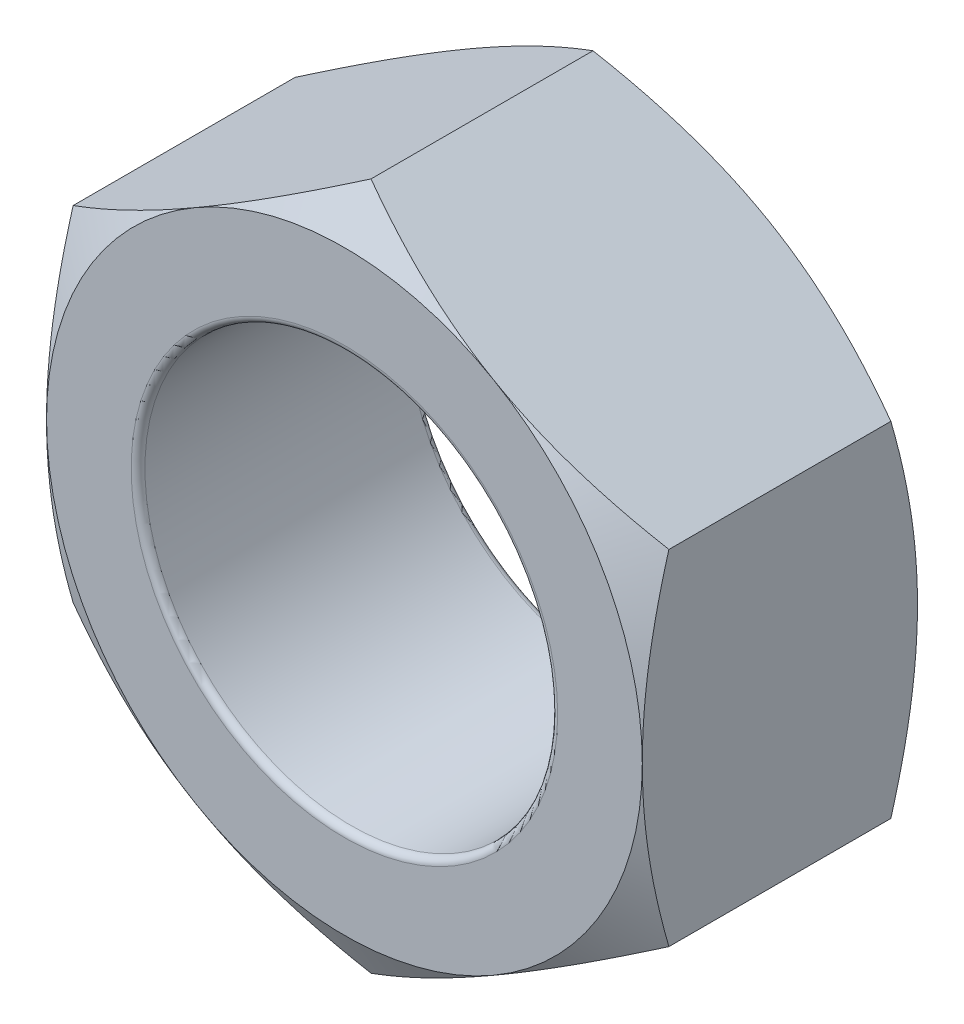
ISO-10303-21;
HEADER;
FILE_DESCRIPTION(('STEP AP214'),'2;1');
FILE_NAME('part.step','',(''),(''),'','','');
FILE_SCHEMA(('AUTOMOTIVE_DESIGN { 1 0 10303 214 1 1 1 1 }'));
ENDSEC;
DATA;
#1=APPLICATION_CONTEXT('core data for automotive mechanical design processes');
#2=APPLICATION_PROTOCOL_DEFINITION('international standard','automotive_design',2000,#1);
#3=PRODUCT_CONTEXT('',#1,'mechanical');
#4=PRODUCT('Part','Part','',(#3));
#5=PRODUCT_RELATED_PRODUCT_CATEGORY('part','',(#4));
#6=PRODUCT_DEFINITION_FORMATION('','',#4);
#7=PRODUCT_DEFINITION_CONTEXT('part definition',#1,'design');
#8=PRODUCT_DEFINITION('design','',#6,#7);
#9=PRODUCT_DEFINITION_SHAPE('','',#8);
#10=(LENGTH_UNIT() NAMED_UNIT(*) SI_UNIT(.MILLI.,.METRE.));
#11=(NAMED_UNIT(*) PLANE_ANGLE_UNIT() SI_UNIT($,.RADIAN.));
#12=(NAMED_UNIT(*) SI_UNIT($,.STERADIAN.) SOLID_ANGLE_UNIT());
#13=UNCERTAINTY_MEASURE_WITH_UNIT(LENGTH_MEASURE(1.E-05),#10,'distance_accuracy_value','');
#14=(GEOMETRIC_REPRESENTATION_CONTEXT(3) GLOBAL_UNCERTAINTY_ASSIGNED_CONTEXT((#13)) GLOBAL_UNIT_ASSIGNED_CONTEXT((#10,
#11,#12)) REPRESENTATION_CONTEXT('',''));
#15=CARTESIAN_POINT('',(0.,0.,0.));
#16=DIRECTION('',(0.,0.,1.));
#17=DIRECTION('',(1.,0.,0.));
#18=AXIS2_PLACEMENT_3D('',#15,#16,#17);
#19=CARTESIAN_POINT('',(2.1650635094611,1.25,2.));
#20=DIRECTION('',(-0.5,-0.866025403784439,0.));
#21=DIRECTION('',(0.866025403784439,-0.5,0.));
#22=AXIS2_PLACEMENT_3D('',#19,#20,#21);
#23=PLANE('',#22);
#24=CARTESIAN_POINT('',(-0.000199999999999995,2.50011547005384,0.193442344259319));
#25=CARTESIAN_POINT('',(0.0949448044588714,2.44518359158751,0.1617138656523));
#26=CARTESIAN_POINT('',(0.19091089006067,2.38977754623224,0.132857638622771));
#27=CARTESIAN_POINT('',(0.384504924957482,2.27800597807106,0.082488041578461));
#28=CARTESIAN_POINT('',(0.482136314962227,2.22163846877046,0.0609924917932506));
#29=CARTESIAN_POINT('',(0.676189096729384,2.1096020429802,0.0275304926651336));
#30=CARTESIAN_POINT('',(0.772580625603762,2.05395036783698,0.0153413537334432));
#31=CARTESIAN_POINT('',(0.965817397426061,1.94238506560804,0.000788247088698151));
#32=CARTESIAN_POINT('',(1.06266193768815,1.88647184421818,-0.00158776993784357));
#33=CARTESIAN_POINT('',(1.24363193289309,1.78198876877136,0.00334676203409698));
#34=CARTESIAN_POINT('',(1.32778443459629,1.73340329926004,0.00944571351687403));
#35=CARTESIAN_POINT('',(1.49554116707323,1.63654890460611,0.028778422494548));
#36=CARTESIAN_POINT('',(1.57914481731117,1.588280314636,0.0420187884503186));
#37=CARTESIAN_POINT('',(1.74724762493064,1.49122611340536,0.0751197068916935));
#38=CARTESIAN_POINT('',(1.83172549874872,1.44245279021593,0.095120617710467));
#39=CARTESIAN_POINT('',(1.99942104705477,1.34563372025953,0.140515214481965));
#40=CARTESIAN_POINT('',(2.08264087112059,1.29758673243321,0.165898229502511));
#41=CARTESIAN_POINT('',(2.1652635094611,1.24988452994616,0.193442344259319));
#42=B_SPLINE_CURVE_WITH_KNOTS('',3,(#24,#25,#26,#27,#28,#29,#30,#31,#32,#33,#34,#35,#36,#37,#38,
#39,#40,#41),.UNSPECIFIED.,.F.,.F.,(4,2,2,2,2,2,2,2,4),(0.,0.343195712322224,0.687216523785884,
1.02272234384044,1.3578160810825,1.64962474967976,1.94170391412719,2.24026314832885,
2.5382358827389),.UNSPECIFIED.);
#43=CARTESIAN_POINT('',(0.,2.5,0.193375672974063));
#44=VERTEX_POINT('',#43);
#45=CARTESIAN_POINT('',(1.08253175473055,1.875,0.));
#46=VERTEX_POINT('',#45);
#47=EDGE_CURVE('E60',#44,#46,#42,.T.);
#48=ORIENTED_EDGE('',*,*,#47,.F.);
#49=DIRECTION('',(0.,0.,-1.));
#50=VECTOR('',#49,1.);
#51=CARTESIAN_POINT('',(0.,2.5,2.));
#52=LINE('',#51,#50);
#53=CARTESIAN_POINT('',(0.,2.5,1.80662432702594));
#54=VERTEX_POINT('',#53);
#55=EDGE_CURVE('E178',#54,#44,#52,.T.);
#56=ORIENTED_EDGE('',*,*,#55,.F.);
#57=CARTESIAN_POINT('',(2.1652635094611,1.24988452994616,1.80655765574068));
#58=CARTESIAN_POINT('',(2.07011870500222,1.30481640841249,1.8382861343477));
#59=CARTESIAN_POINT('',(1.97415261940043,1.36022245376776,1.86714236137723));
#60=CARTESIAN_POINT('',(1.78055858450361,1.47199402192894,1.91751195842154));
#61=CARTESIAN_POINT('',(1.68292719449887,1.52836153122954,1.93900750820675));
#62=CARTESIAN_POINT('',(1.48887441273171,1.6403979570198,1.97246950733487));
#63=CARTESIAN_POINT('',(1.39248288385733,1.69604963216302,1.98465864626656));
#64=CARTESIAN_POINT('',(1.19924611203503,1.80761493439196,1.9992117529113));
#65=CARTESIAN_POINT('',(1.10240157177295,1.86352815578182,2.00158776993784));
#66=CARTESIAN_POINT('',(0.921431576568005,1.96801123122864,1.9966532379659));
#67=CARTESIAN_POINT('',(0.837279074864811,2.01659670073996,1.99055428648313));
#68=CARTESIAN_POINT('',(0.669522342387871,2.11345109539389,1.97122157750545));
#69=CARTESIAN_POINT('',(0.58591869214993,2.161719685364,1.95798121154968));
#70=CARTESIAN_POINT('',(0.417815884530456,2.25877388659464,1.92488029310831));
#71=CARTESIAN_POINT('',(0.333338010712378,2.30754720978407,1.90487938228953));
#72=CARTESIAN_POINT('',(0.165642462406328,2.40436627974047,1.85948478551803));
#73=CARTESIAN_POINT('',(0.0824226383405097,2.45241326756679,1.83410177049749));
#74=CARTESIAN_POINT('',(-0.000199999999999675,2.50011547005384,1.80655765574068));
#75=B_SPLINE_CURVE_WITH_KNOTS('',3,(#57,#58,#59,#60,#61,#62,#63,#64,#65,#66,#67,#68,#69,#70,#71,
#72,#73,#74),.UNSPECIFIED.,.F.,.F.,(4,2,2,2,2,2,2,2,4),(0.,0.343195712322224,0.687216523785883,
1.02272234384043,1.3578160810825,1.64962474967976,1.94170391412719,2.24026314832885,
2.5382358827389),.UNSPECIFIED.);
#76=CARTESIAN_POINT('',(1.08253175473055,1.875,2.));
#77=VERTEX_POINT('',#76);
#78=EDGE_CURVE('E207',#77,#54,#75,.T.);
#79=ORIENTED_EDGE('',*,*,#78,.F.);
#80=CARTESIAN_POINT('',(2.1650635094611,1.25,1.80662432702594));
#81=VERTEX_POINT('',#80);
#82=EDGE_CURVE('E169',#81,#77,#75,.T.);
#83=ORIENTED_EDGE('',*,*,#82,.F.);
#84=DIRECTION('',(0.,0.,-1.));
#85=VECTOR('',#84,1.);
#86=CARTESIAN_POINT('',(2.1650635094611,1.25,2.));
#87=LINE('',#86,#85);
#88=CARTESIAN_POINT('',(2.1650635094611,1.25,0.193375672974063));
#89=VERTEX_POINT('',#88);
#90=EDGE_CURVE('E164',#81,#89,#87,.T.);
#91=ORIENTED_EDGE('',*,*,#90,.T.);
#92=EDGE_CURVE('E157',#46,#89,#42,.T.);
#93=ORIENTED_EDGE('',*,*,#92,.F.);
#94=EDGE_LOOP('',(#48,#56,#79,#83,#91,#93));
#95=FACE_BOUND('',#94,.T.);
#96=ADVANCED_FACE('F45',(#95),#23,.F.);
#97=CARTESIAN_POINT('',(0.,2.5,2.));
#98=DIRECTION('',(0.5,-0.866025403784439,0.));
#99=DIRECTION('',(0.866025403784439,0.5,0.));
#100=AXIS2_PLACEMENT_3D('',#97,#98,#99);
#101=PLANE('',#100);
#102=CARTESIAN_POINT('',(-2.1652635094611,1.24988452994616,0.193442344259319));
#103=CARTESIAN_POINT('',(-2.07011870500223,1.30481640841249,0.161713865652301));
#104=CARTESIAN_POINT('',(-1.97415261940043,1.36022245376776,0.132857638622771));
#105=CARTESIAN_POINT('',(-1.78055858450361,1.47199402192894,0.0824880415784613));
#106=CARTESIAN_POINT('',(-1.68292719449887,1.52836153122954,0.0609924917932509));
#107=CARTESIAN_POINT('',(-1.48887441273171,1.6403979570198,0.027530492665134));
#108=CARTESIAN_POINT('',(-1.39248288385734,1.69604963216302,0.0153413537334436));
#109=CARTESIAN_POINT('',(-1.19924611203504,1.80761493439196,0.000788247088698235));
#110=CARTESIAN_POINT('',(-1.10240157177295,1.86352815578182,-0.00158776993784379));
#111=CARTESIAN_POINT('',(-0.921431576568005,1.96801123122864,0.00334676203409682));
#112=CARTESIAN_POINT('',(-0.837279074864811,2.01659670073996,0.00944571351687416));
#113=CARTESIAN_POINT('',(-0.669522342387871,2.11345109539389,0.0287784224945482));
#114=CARTESIAN_POINT('',(-0.585918692149931,2.161719685364,0.0420187884503187));
#115=CARTESIAN_POINT('',(-0.417815884530456,2.25877388659464,0.0751197068916935));
#116=CARTESIAN_POINT('',(-0.333338010712378,2.30754720978407,0.095120617710467));
#117=CARTESIAN_POINT('',(-0.165642462406328,2.40436627974047,0.140515214481965));
#118=CARTESIAN_POINT('',(-0.0824226383405097,2.45241326756679,0.165898229502511));
#119=CARTESIAN_POINT('',(0.000199999999999957,2.50011547005384,0.193442344259319));
#120=B_SPLINE_CURVE_WITH_KNOTS('',3,(#102,#103,#104,#105,#106,#107,#108,#109,#110,#111,#112,
#113,#114,#115,#116,#117,#118,#119),.UNSPECIFIED.,.F.,.F.,(4,2,2,2,2,2,2,2,4),(0.,
0.343195712322224,0.687216523785883,1.02272234384043,1.3578160810825,1.64962474967976,
1.94170391412719,2.24026314832885,2.5382358827389),.UNSPECIFIED.);
#121=CARTESIAN_POINT('',(-2.1650635094611,1.25,0.193375672974064));
#122=VERTEX_POINT('',#121);
#123=CARTESIAN_POINT('',(-1.08253175473055,1.875,0.));
#124=VERTEX_POINT('',#123);
#125=EDGE_CURVE('E68',#122,#124,#120,.T.);
#126=ORIENTED_EDGE('',*,*,#125,.F.);
#127=DIRECTION('',(0.,0.,-1.));
#128=VECTOR('',#127,1.);
#129=CARTESIAN_POINT('',(-2.1650635094611,1.25,2.));
#130=LINE('',#129,#128);
#131=CARTESIAN_POINT('',(-2.1650635094611,1.25,1.80662432702594));
#132=VERTEX_POINT('',#131);
#133=EDGE_CURVE('E175',#132,#122,#130,.T.);
#134=ORIENTED_EDGE('',*,*,#133,.F.);
#135=CARTESIAN_POINT('',(0.000200000000000043,2.50011547005384,1.80655765574068));
#136=CARTESIAN_POINT('',(-0.0949448044588711,2.44518359158751,1.8382861343477));
#137=CARTESIAN_POINT('',(-0.190910890060669,2.38977754623224,1.86714236137723));
#138=CARTESIAN_POINT('',(-0.384504924957483,2.27800597807106,1.91751195842154));
#139=CARTESIAN_POINT('',(-0.482136314962227,2.22163846877046,1.93900750820675));
#140=CARTESIAN_POINT('',(-0.676189096729384,2.1096020429802,1.97246950733487));
#141=CARTESIAN_POINT('',(-0.772580625603762,2.05395036783698,1.98465864626656));
#142=CARTESIAN_POINT('',(-0.965817397426061,1.94238506560804,1.9992117529113));
#143=CARTESIAN_POINT('',(-1.06266193768815,1.88647184421818,2.00158776993784));
#144=CARTESIAN_POINT('',(-1.24363193289309,1.78198876877136,1.9966532379659));
#145=CARTESIAN_POINT('',(-1.32778443459629,1.73340329926004,1.99055428648313));
#146=CARTESIAN_POINT('',(-1.49554116707323,1.63654890460611,1.97122157750545));
#147=CARTESIAN_POINT('',(-1.57914481731117,1.588280314636,1.95798121154968));
#148=CARTESIAN_POINT('',(-1.74724762493064,1.49122611340536,1.92488029310831));
#149=CARTESIAN_POINT('',(-1.83172549874872,1.44245279021593,1.90487938228953));
#150=CARTESIAN_POINT('',(-1.99942104705477,1.34563372025953,1.85948478551803));
#151=CARTESIAN_POINT('',(-2.08264087112059,1.29758673243321,1.83410177049749));
#152=CARTESIAN_POINT('',(-2.1652635094611,1.24988452994616,1.80655765574068));
#153=B_SPLINE_CURVE_WITH_KNOTS('',3,(#135,#136,#137,#138,#139,#140,#141,#142,#143,#144,#145,
#146,#147,#148,#149,#150,#151,#152),.UNSPECIFIED.,.F.,.F.,(4,2,2,2,2,2,2,2,4),(0.,
0.343195712322224,0.687216523785883,1.02272234384044,1.3578160810825,1.64962474967976,
1.94170391412719,2.24026314832885,2.5382358827389),.UNSPECIFIED.);
#154=CARTESIAN_POINT('',(-1.08253175473055,1.875,2.));
#155=VERTEX_POINT('',#154);
#156=EDGE_CURVE('E240',#155,#132,#153,.T.);
#157=ORIENTED_EDGE('',*,*,#156,.F.);
#158=EDGE_CURVE('E373',#54,#155,#153,.T.);
#159=ORIENTED_EDGE('',*,*,#158,.F.);
#160=ORIENTED_EDGE('',*,*,#55,.T.);
#161=EDGE_CURVE('E264',#124,#44,#120,.T.);
#162=ORIENTED_EDGE('',*,*,#161,.F.);
#163=EDGE_LOOP('',(#126,#134,#157,#159,#160,#162));
#164=FACE_BOUND('',#163,.T.);
#165=ADVANCED_FACE('F250',(#164),#101,.F.);
#166=CARTESIAN_POINT('',(-2.1650635094611,1.25,2.));
#167=DIRECTION('',(1.,0.,0.));
#168=DIRECTION('',(0.,1.,0.));
#169=AXIS2_PLACEMENT_3D('',#166,#167,#168);
#170=PLANE('',#169);
#171=CARTESIAN_POINT('',(-2.1650635094611,-4.38138901551839,1.57158759715785));
#172=CARTESIAN_POINT('',(-2.1650635094611,-4.27974320635703,1.51898216705399));
#173=CARTESIAN_POINT('',(-2.1650635094611,-4.17795510299245,1.46664938583593));
#174=CARTESIAN_POINT('',(-2.1650635094611,-3.97402861616026,1.36266697294024));
#175=CARTESIAN_POINT('',(-2.1650635094611,-3.87189022690588,1.31101735261765));
#176=CARTESIAN_POINT('',(-2.1650635094611,-3.66704114189222,1.20846091361717));
#177=CARTESIAN_POINT('',(-2.1650635094611,-3.56432980178112,1.15755537982374));
#178=CARTESIAN_POINT('',(-2.1650635094611,-3.35840769205361,1.05675950176691));
#179=CARTESIAN_POINT('',(-2.1650635094611,-3.25519691555886,1.00686917153464));
#180=CARTESIAN_POINT('',(-2.1650635094611,-3.04258477583953,0.905690321368477));
#181=CARTESIAN_POINT('',(-2.1650635094611,-2.93315003787373,0.854471742614521));
#182=CARTESIAN_POINT('',(-2.1650635094611,-2.71346238246723,0.753821975604332));
#183=CARTESIAN_POINT('',(-2.1650635094611,-2.6032094859732,0.70439074177713));
#184=CARTESIAN_POINT('',(-2.1650635094611,-2.38176528384165,0.607869019421328));
#185=CARTESIAN_POINT('',(-2.1650635094611,-2.27057464684206,0.560777004884744));
#186=CARTESIAN_POINT('',(-2.1650635094611,-2.04692886953807,0.469607139158253));
#187=CARTESIAN_POINT('',(-2.1650635094611,-1.93447345396755,0.425529959499214));
#188=CARTESIAN_POINT('',(-2.1650635094611,-1.69155934507445,0.335244432967745));
#189=CARTESIAN_POINT('',(-2.1650635094611,-1.56086506164026,0.289661432979877));
#190=CARTESIAN_POINT('',(-2.1650635094611,-1.29717610461504,0.20580176378342));
#191=CARTESIAN_POINT('',(-2.1650635094611,-1.16418258582886,0.167521536679473));
#192=CARTESIAN_POINT('',(-2.1650635094611,-0.898294408619391,0.10158210570768));
#193=CARTESIAN_POINT('',(-2.1650635094611,-0.765448962486345,0.073729330050185));
#194=CARTESIAN_POINT('',(-2.1650635094611,-0.497720782983937,0.0304722539571152));
#195=CARTESIAN_POINT('',(-2.1650635094611,-0.362839316439239,0.0150605135229217));
#196=CARTESIAN_POINT('',(-2.1650635094611,-0.158863529890208,0.00273414473692031));
#197=CARTESIAN_POINT('',(-2.1650635094611,-0.090068444364939,0.000448741642451473));
#198=CARTESIAN_POINT('',(-2.1650635094611,0.0475481326546501,-0.000328212758942585));
#199=CARTESIAN_POINT('',(-2.1650635094611,0.116369624067512,0.00118022432327848));
#200=CARTESIAN_POINT('',(-2.1650635094611,0.253836700442165,0.0079399879930239));
#201=CARTESIAN_POINT('',(-2.1650635094611,0.322482256006684,0.0131919037603656));
#202=CARTESIAN_POINT('',(-2.1650635094611,0.459414488352476,0.0272386710887369));
#203=CARTESIAN_POINT('',(-2.1650635094611,0.527701103419813,0.0360341129373577));
#204=CARTESIAN_POINT('',(-2.1650635094611,0.734598762742222,0.0677303113674989));
#205=CARTESIAN_POINT('',(-2.1650635094611,0.872431714302957,0.0957841303305624));
#206=CARTESIAN_POINT('',(-2.1650635094611,1.14549125177638,0.16235612657983));
#207=CARTESIAN_POINT('',(-2.1650635094611,1.2807168061037,0.200878358141761));
#208=CARTESIAN_POINT('',(-2.1650635094611,1.54796786349162,0.285281744249492));
#209=CARTESIAN_POINT('',(-2.1650635094611,1.68000715451591,0.331119977213347));
#210=CARTESIAN_POINT('',(-2.1650635094611,1.94209594708302,0.42820668513352));
#211=CARTESIAN_POINT('',(-2.1650635094611,2.07214486683654,0.479456708646411));
#212=CARTESIAN_POINT('',(-2.1650635094611,2.33077403028862,0.585918205173928));
#213=CARTESIAN_POINT('',(-2.1650635094611,2.45935239390319,0.641134207602664));
#214=CARTESIAN_POINT('',(-2.1650635094611,2.71524001180106,0.754436206976413));
#215=CARTESIAN_POINT('',(-2.1650635094611,2.84254918967251,0.812522375481877));
#216=CARTESIAN_POINT('',(-2.1650635094611,3.08859963366269,0.927308809324676));
#217=CARTESIAN_POINT('',(-2.1650635094611,3.20739899369663,0.98388506577253));
#218=CARTESIAN_POINT('',(-2.1650635094611,3.44429024385032,1.09850767575694));
#219=CARTESIAN_POINT('',(-2.1650635094611,3.56238210743964,1.15655408400138));
#220=CARTESIAN_POINT('',(-2.1650635094611,3.79756228458607,1.27358389507046));
#221=CARTESIAN_POINT('',(-2.1650635094611,3.91465268731236,1.33256310942753));
#222=CARTESIAN_POINT('',(-2.1650635094611,4.14835324969922,1.45143994155349));
#223=CARTESIAN_POINT('',(-2.1650635094611,4.2649634522388,1.51133747496262));
#224=CARTESIAN_POINT('',(-2.1650635094611,4.38138901551839,1.57158759715785));
#225=B_SPLINE_CURVE_WITH_KNOTS('',3,(#171,#172,#173,#174,#175,#176,#177,#178,#179,#180,#181,
#182,#183,#184,#185,#186,#187,#188,#189,#190,#191,#192,#193,#194,#195,#196,#197,#198,#199,#200,
#201,#202,#203,#204,#205,#206,#207,#208,#209,#210,#211,#212,#213,#214,#215,#216,#217,#218,#219,
#220,#221,#222,#223,#224),.UNSPECIFIED.,.F.,.F.,(4,2,2,2,2,2,2,2,2,2,2,2,2,2,2,2,2,2,2,2,2,2,2,
2,2,2,4),(0.,0.343356393060417,0.686718486004803,1.03061638310587,1.37451902999478,
1.73698924938794,2.09945022054742,2.46167154560577,2.82397329164198,3.239068015015,
3.65395998574555,4.0607152759191,4.46722713736472,4.67363462237933,4.88004147569517,
5.08648082221389,5.29295457203617,5.71432413969706,6.13585713128455,6.55500229966534,
6.97426773100619,7.39401984791987,7.81379708539478,8.20853458715374,8.6032867996897,
8.99659958428232,9.38987645184433),.UNSPECIFIED.);
#226=CARTESIAN_POINT('',(-2.1650635094611,-1.25,0.193375672974063));
#227=VERTEX_POINT('',#226);
#228=CARTESIAN_POINT('',(-2.1650635094611,0.,0.));
#229=VERTEX_POINT('',#228);
#230=EDGE_CURVE('E262',#227,#229,#225,.T.);
#231=ORIENTED_EDGE('',*,*,#230,.F.);
#232=DIRECTION('',(0.,0.,-1.));
#233=VECTOR('',#232,1.);
#234=CARTESIAN_POINT('',(-2.1650635094611,-1.25,2.));
#235=LINE('',#234,#233);
#236=CARTESIAN_POINT('',(-2.1650635094611,-1.25,1.80662432702594));
#237=VERTEX_POINT('',#236);
#238=EDGE_CURVE('E166',#237,#227,#235,.T.);
#239=ORIENTED_EDGE('',*,*,#238,.F.);
#240=CARTESIAN_POINT('',(-2.1650635094611,4.38138901551839,0.428412402842148));
#241=CARTESIAN_POINT('',(-2.1650635094611,4.27974320635703,0.481017832946005));
#242=CARTESIAN_POINT('',(-2.1650635094611,4.17795510299245,0.533350614164066));
#243=CARTESIAN_POINT('',(-2.1650635094611,3.97402861616026,0.63733302705976));
#244=CARTESIAN_POINT('',(-2.1650635094611,3.87189022690588,0.688982647382354));
#245=CARTESIAN_POINT('',(-2.1650635094611,3.66704114189222,0.791539086382831));
#246=CARTESIAN_POINT('',(-2.1650635094611,3.56432980178112,0.842444620176263));
#247=CARTESIAN_POINT('',(-2.1650635094611,3.35840769205361,0.943240498233089));
#248=CARTESIAN_POINT('',(-2.1650635094611,3.25519691555886,0.993130828465358));
#249=CARTESIAN_POINT('',(-2.1650635094611,3.04258477583953,1.09430967863152));
#250=CARTESIAN_POINT('',(-2.1650635094611,2.93315003787373,1.14552825738548));
#251=CARTESIAN_POINT('',(-2.1650635094611,2.71346238246723,1.24617802439567));
#252=CARTESIAN_POINT('',(-2.1650635094611,2.6032094859732,1.29560925822287));
#253=CARTESIAN_POINT('',(-2.1650635094611,2.38176528384165,1.39213098057867));
#254=CARTESIAN_POINT('',(-2.1650635094611,2.27057464684206,1.43922299511526));
#255=CARTESIAN_POINT('',(-2.1650635094611,2.04692886953808,1.53039286084175));
#256=CARTESIAN_POINT('',(-2.1650635094611,1.93447345396755,1.57447004050079));
#257=CARTESIAN_POINT('',(-2.1650635094611,1.69155934507445,1.66475556703225));
#258=CARTESIAN_POINT('',(-2.1650635094611,1.56086506164027,1.71033856702012));
#259=CARTESIAN_POINT('',(-2.1650635094611,1.29717610461504,1.79419823621658));
#260=CARTESIAN_POINT('',(-2.1650635094611,1.16418258582886,1.83247846332053));
#261=CARTESIAN_POINT('',(-2.1650635094611,0.898294408619392,1.89841789429232));
#262=CARTESIAN_POINT('',(-2.1650635094611,0.765448962486346,1.92627066994981));
#263=CARTESIAN_POINT('',(-2.1650635094611,0.497720782983938,1.96952774604288));
#264=CARTESIAN_POINT('',(-2.1650635094611,0.36283931643924,1.98493948647708));
#265=CARTESIAN_POINT('',(-2.1650635094611,0.158863529890209,1.99726585526308));
#266=CARTESIAN_POINT('',(-2.1650635094611,0.0900684443649401,1.99955125835755));
#267=CARTESIAN_POINT('',(-2.1650635094611,-0.0475481326546487,2.00032821275894));
#268=CARTESIAN_POINT('',(-2.1650635094611,-0.11636962406751,1.99881977567672));
#269=CARTESIAN_POINT('',(-2.1650635094611,-0.253836700442163,1.99206001200698));
#270=CARTESIAN_POINT('',(-2.1650635094611,-0.322482256006683,1.98680809623963));
#271=CARTESIAN_POINT('',(-2.1650635094611,-0.459414488352474,1.97276132891126));
#272=CARTESIAN_POINT('',(-2.1650635094611,-0.527701103419812,1.96396588706264));
#273=CARTESIAN_POINT('',(-2.1650635094611,-0.734598762742221,1.9322696886325));
#274=CARTESIAN_POINT('',(-2.1650635094611,-0.872431714302956,1.90421586966944));
#275=CARTESIAN_POINT('',(-2.1650635094611,-1.14549125177638,1.83764387342017));
#276=CARTESIAN_POINT('',(-2.1650635094611,-1.28071680610369,1.79912164185824));
#277=CARTESIAN_POINT('',(-2.1650635094611,-1.54796786349162,1.71471825575051));
#278=CARTESIAN_POINT('',(-2.1650635094611,-1.68000715451591,1.66888002278665));
#279=CARTESIAN_POINT('',(-2.1650635094611,-1.94209594708302,1.57179331486648));
#280=CARTESIAN_POINT('',(-2.1650635094611,-2.07214486683654,1.52054329135359));
#281=CARTESIAN_POINT('',(-2.1650635094611,-2.33077403028862,1.41408179482607));
#282=CARTESIAN_POINT('',(-2.1650635094611,-2.45935239390319,1.35886579239734));
#283=CARTESIAN_POINT('',(-2.1650635094611,-2.71524001180106,1.24556379302359));
#284=CARTESIAN_POINT('',(-2.1650635094611,-2.8425491896725,1.18747762451812));
#285=CARTESIAN_POINT('',(-2.1650635094611,-3.08859963366269,1.07269119067533));
#286=CARTESIAN_POINT('',(-2.1650635094611,-3.20739899369662,1.01611493422747));
#287=CARTESIAN_POINT('',(-2.1650635094611,-3.44429024385032,0.90149232424306));
#288=CARTESIAN_POINT('',(-2.1650635094611,-3.56238210743963,0.843445915998621));
#289=CARTESIAN_POINT('',(-2.1650635094611,-3.79756228458607,0.726416104929537));
#290=CARTESIAN_POINT('',(-2.1650635094611,-3.91465268731236,0.667436890572473));
#291=CARTESIAN_POINT('',(-2.1650635094611,-4.14835324969922,0.548560058446514));
#292=CARTESIAN_POINT('',(-2.1650635094611,-4.2649634522388,0.488662525037376));
#293=CARTESIAN_POINT('',(-2.1650635094611,-4.38138901551839,0.428412402842149));
#294=B_SPLINE_CURVE_WITH_KNOTS('',3,(#240,#241,#242,#243,#244,#245,#246,#247,#248,#249,#250,
#251,#252,#253,#254,#255,#256,#257,#258,#259,#260,#261,#262,#263,#264,#265,#266,#267,#268,#269,
#270,#271,#272,#273,#274,#275,#276,#277,#278,#279,#280,#281,#282,#283,#284,#285,#286,#287,#288,
#289,#290,#291,#292,#293),.UNSPECIFIED.,.F.,.F.,(4,2,2,2,2,2,2,2,2,2,2,2,2,2,2,2,2,2,2,2,2,2,2,
2,2,2,4),(0.,0.343356393060417,0.686718486004803,1.03061638310587,1.37451902999478,
1.73698924938794,2.09945022054742,2.46167154560577,2.82397329164198,3.239068015015,
3.65395998574555,4.0607152759191,4.46722713736472,4.67363462237933,4.88004147569517,
5.08648082221389,5.29295457203617,5.71432413969706,6.13585713128455,6.55500229966534,
6.97426773100619,7.39401984791988,7.81379708539478,8.20853458715374,8.6032867996897,
8.99659958428232,9.38987645184433),.UNSPECIFIED.);
#295=CARTESIAN_POINT('',(-2.1650635094611,0.,2.));
#296=VERTEX_POINT('',#295);
#297=EDGE_CURVE('E232',#296,#237,#294,.T.);
#298=ORIENTED_EDGE('',*,*,#297,.F.);
#299=EDGE_CURVE('E238',#132,#296,#294,.T.);
#300=ORIENTED_EDGE('',*,*,#299,.F.);
#301=ORIENTED_EDGE('',*,*,#133,.T.);
#302=EDGE_CURVE('E256',#229,#122,#225,.T.);
#303=ORIENTED_EDGE('',*,*,#302,.F.);
#304=EDGE_LOOP('',(#231,#239,#298,#300,#301,#303));
#305=FACE_BOUND('',#304,.T.);
#306=ADVANCED_FACE('F246',(#305),#170,.F.);
#307=CARTESIAN_POINT('',(-2.1650635094611,-1.25,2.));
#308=DIRECTION('',(0.5,0.866025403784439,0.));
#309=DIRECTION('',(-0.866025403784439,0.5,0.));
#310=AXIS2_PLACEMENT_3D('',#307,#308,#309);
#311=PLANE('',#310);
#312=CARTESIAN_POINT('',(0.000199999999999721,-2.50011547005384,0.193442344259319));
#313=CARTESIAN_POINT('',(-0.0949448044588714,-2.44518359158751,0.161713865652301));
#314=CARTESIAN_POINT('',(-0.19091089006067,-2.38977754623224,0.132857638622771));
#315=CARTESIAN_POINT('',(-0.384504924957483,-2.27800597807106,0.0824880415784611));
#316=CARTESIAN_POINT('',(-0.482136314962227,-2.22163846877046,0.0609924917932507));
#317=CARTESIAN_POINT('',(-0.676189096729385,-2.1096020429802,0.0275304926651337));
#318=CARTESIAN_POINT('',(-0.772580625603762,-2.05395036783698,0.0153413537334433));
#319=CARTESIAN_POINT('',(-0.965817397426061,-1.94238506560804,0.000788247088698076));
#320=CARTESIAN_POINT('',(-1.06266193768815,-1.88647184421818,-0.00158776993784381));
#321=CARTESIAN_POINT('',(-1.24363193289309,-1.78198876877136,0.00334676203409683));
#322=CARTESIAN_POINT('',(-1.32778443459629,-1.73340329926004,0.0094457135168741));
#323=CARTESIAN_POINT('',(-1.49554116707323,-1.63654890460611,0.0287784224945481));
#324=CARTESIAN_POINT('',(-1.57914481731117,-1.588280314636,0.0420187884503187));
#325=CARTESIAN_POINT('',(-1.74724762493064,-1.49122611340536,0.0751197068916934));
#326=CARTESIAN_POINT('',(-1.83172549874872,-1.44245279021593,0.0951206177104669));
#327=CARTESIAN_POINT('',(-1.99942104705477,-1.34563372025953,0.140515214481965));
#328=CARTESIAN_POINT('',(-2.08264087112059,-1.29758673243321,0.165898229502511));
#329=CARTESIAN_POINT('',(-2.1652635094611,-1.24988452994616,0.193442344259319));
#330=B_SPLINE_CURVE_WITH_KNOTS('',3,(#312,#313,#314,#315,#316,#317,#318,#319,#320,#321,#322,
#323,#324,#325,#326,#327,#328,#329),.UNSPECIFIED.,.F.,.F.,(4,2,2,2,2,2,2,2,4),(0.,
0.343195712322223,0.687216523785883,1.02272234384044,1.3578160810825,1.64962474967976,
1.94170391412719,2.24026314832885,2.5382358827389),.UNSPECIFIED.);
#331=CARTESIAN_POINT('',(0.,-2.5,0.193375672974063));
#332=VERTEX_POINT('',#331);
#333=CARTESIAN_POINT('',(-1.08253175473055,-1.875,0.));
#334=VERTEX_POINT('',#333);
#335=EDGE_CURVE('E308',#332,#334,#330,.T.);
#336=ORIENTED_EDGE('',*,*,#335,.F.);
#337=DIRECTION('',(0.,0.,-1.));
#338=VECTOR('',#337,1.);
#339=CARTESIAN_POINT('',(0.,-2.5,2.));
#340=LINE('',#339,#338);
#341=CARTESIAN_POINT('',(0.,-2.5,1.80662432702594));
#342=VERTEX_POINT('',#341);
#343=EDGE_CURVE('E163',#342,#332,#340,.T.);
#344=ORIENTED_EDGE('',*,*,#343,.F.);
#345=CARTESIAN_POINT('',(-2.1652635094611,-1.24988452994616,1.80655765574068));
#346=CARTESIAN_POINT('',(-2.07011870500222,-1.30481640841249,1.8382861343477));
#347=CARTESIAN_POINT('',(-1.97415261940043,-1.36022245376776,1.86714236137723));
#348=CARTESIAN_POINT('',(-1.78055858450361,-1.47199402192894,1.91751195842154));
#349=CARTESIAN_POINT('',(-1.68292719449887,-1.52836153122954,1.93900750820675));
#350=CARTESIAN_POINT('',(-1.48887441273171,-1.6403979570198,1.97246950733487));
#351=CARTESIAN_POINT('',(-1.39248288385734,-1.69604963216302,1.98465864626656));
#352=CARTESIAN_POINT('',(-1.19924611203504,-1.80761493439196,1.9992117529113));
#353=CARTESIAN_POINT('',(-1.10240157177295,-1.86352815578182,2.00158776993784));
#354=CARTESIAN_POINT('',(-0.921431576568005,-1.96801123122864,1.9966532379659));
#355=CARTESIAN_POINT('',(-0.837279074864811,-2.01659670073996,1.99055428648313));
#356=CARTESIAN_POINT('',(-0.669522342387871,-2.11345109539389,1.97122157750545));
#357=CARTESIAN_POINT('',(-0.585918692149931,-2.161719685364,1.95798121154968));
#358=CARTESIAN_POINT('',(-0.417815884530457,-2.25877388659464,1.92488029310831));
#359=CARTESIAN_POINT('',(-0.333338010712379,-2.30754720978407,1.90487938228953));
#360=CARTESIAN_POINT('',(-0.165642462406329,-2.40436627974047,1.85948478551803));
#361=CARTESIAN_POINT('',(-0.0824226383405103,-2.45241326756679,1.83410177049749));
#362=CARTESIAN_POINT('',(0.000199999999999454,-2.50011547005384,1.80655765574068));
#363=B_SPLINE_CURVE_WITH_KNOTS('',3,(#345,#346,#347,#348,#349,#350,#351,#352,#353,#354,#355,
#356,#357,#358,#359,#360,#361,#362),.UNSPECIFIED.,.F.,.F.,(4,2,2,2,2,2,2,2,4),(0.,
0.343195712322223,0.687216523785883,1.02272234384043,1.3578160810825,1.64962474967976,
1.94170391412719,2.24026314832885,2.5382358827389),.UNSPECIFIED.);
#364=CARTESIAN_POINT('',(-1.08253175473055,-1.875,2.));
#365=VERTEX_POINT('',#364);
#366=EDGE_CURVE('E225',#365,#342,#363,.T.);
#367=ORIENTED_EDGE('',*,*,#366,.F.);
#368=EDGE_CURVE('E239',#237,#365,#363,.T.);
#369=ORIENTED_EDGE('',*,*,#368,.F.);
#370=ORIENTED_EDGE('',*,*,#238,.T.);
#371=EDGE_CURVE('E263',#334,#227,#330,.T.);
#372=ORIENTED_EDGE('',*,*,#371,.F.);
#373=EDGE_LOOP('',(#336,#344,#367,#369,#370,#372));
#374=FACE_BOUND('',#373,.T.);
#375=ADVANCED_FACE('F249',(#374),#311,.F.);
#376=CARTESIAN_POINT('',(0.,-2.5,2.));
#377=DIRECTION('',(-0.5,0.866025403784439,0.));
#378=DIRECTION('',(-0.866025403784439,-0.5,0.));
#379=AXIS2_PLACEMENT_3D('',#376,#377,#378);
#380=PLANE('',#379);
#381=CARTESIAN_POINT('',(2.1652635094611,-1.24988452994616,0.193442344259319));
#382=CARTESIAN_POINT('',(2.07011870500223,-1.30481640841249,0.161713865652301));
#383=CARTESIAN_POINT('',(1.97415261940043,-1.36022245376776,0.132857638622771));
#384=CARTESIAN_POINT('',(1.78055858450361,-1.47199402192894,0.0824880415784611));
#385=CARTESIAN_POINT('',(1.68292719449887,-1.52836153122954,0.0609924917932507));
#386=CARTESIAN_POINT('',(1.48887441273171,-1.6403979570198,0.0275304926651337));
#387=CARTESIAN_POINT('',(1.39248288385734,-1.69604963216302,0.0153413537334432));
#388=CARTESIAN_POINT('',(1.19924611203504,-1.80761493439196,0.000788247088698007));
#389=CARTESIAN_POINT('',(1.10240157177295,-1.86352815578182,-0.0015877699378438));
#390=CARTESIAN_POINT('',(0.921431576568005,-1.96801123122864,0.00334676203409683));
#391=CARTESIAN_POINT('',(0.837279074864811,-2.01659670073996,0.00944571351687405));
#392=CARTESIAN_POINT('',(0.669522342387871,-2.11345109539389,0.0287784224945481));
#393=CARTESIAN_POINT('',(0.58591869214993,-2.161719685364,0.0420187884503186));
#394=CARTESIAN_POINT('',(0.417815884530456,-2.25877388659464,0.0751197068916934));
#395=CARTESIAN_POINT('',(0.333338010712378,-2.30754720978407,0.095120617710467));
#396=CARTESIAN_POINT('',(0.165642462406328,-2.40436627974047,0.140515214481965));
#397=CARTESIAN_POINT('',(0.0824226383405095,-2.45241326756679,0.165898229502511));
#398=CARTESIAN_POINT('',(-0.000200000000000331,-2.50011547005384,0.193442344259319));
#399=B_SPLINE_CURVE_WITH_KNOTS('',3,(#381,#382,#383,#384,#385,#386,#387,#388,#389,#390,#391,
#392,#393,#394,#395,#396,#397,#398),.UNSPECIFIED.,.F.,.F.,(4,2,2,2,2,2,2,2,4),(0.,
0.343195712322224,0.687216523785883,1.02272234384043,1.3578160810825,1.64962474967976,
1.94170391412719,2.24026314832885,2.5382358827389),.UNSPECIFIED.);
#400=CARTESIAN_POINT('',(2.1650635094611,-1.25,0.193375672974061));
#401=VERTEX_POINT('',#400);
#402=CARTESIAN_POINT('',(1.08253175473055,-1.875,0.));
#403=VERTEX_POINT('',#402);
#404=EDGE_CURVE('E139',#401,#403,#399,.T.);
#405=ORIENTED_EDGE('',*,*,#404,.F.);
#406=DIRECTION('',(0.,0.,-1.));
#407=VECTOR('',#406,1.);
#408=CARTESIAN_POINT('',(2.1650635094611,-1.25,2.));
#409=LINE('',#408,#407);
#410=CARTESIAN_POINT('',(2.1650635094611,-1.25,1.80662432702594));
#411=VERTEX_POINT('',#410);
#412=EDGE_CURVE('E154',#411,#401,#409,.T.);
#413=ORIENTED_EDGE('',*,*,#412,.F.);
#414=CARTESIAN_POINT('',(-0.000200000000000318,-2.50011547005384,1.80655765574068));
#415=CARTESIAN_POINT('',(0.094944804458871,-2.44518359158751,1.8382861343477));
#416=CARTESIAN_POINT('',(0.190910890060669,-2.38977754623224,1.86714236137723));
#417=CARTESIAN_POINT('',(0.384504924957482,-2.27800597807106,1.91751195842154));
#418=CARTESIAN_POINT('',(0.482136314962227,-2.22163846877046,1.93900750820675));
#419=CARTESIAN_POINT('',(0.676189096729384,-2.1096020429802,1.97246950733487));
#420=CARTESIAN_POINT('',(0.772580625603762,-2.05395036783698,1.98465864626656));
#421=CARTESIAN_POINT('',(0.965817397426061,-1.94238506560804,1.9992117529113));
#422=CARTESIAN_POINT('',(1.06266193768815,-1.88647184421818,2.00158776993784));
#423=CARTESIAN_POINT('',(1.24363193289309,-1.78198876877136,1.9966532379659));
#424=CARTESIAN_POINT('',(1.32778443459629,-1.73340329926004,1.99055428648313));
#425=CARTESIAN_POINT('',(1.49554116707323,-1.63654890460611,1.97122157750545));
#426=CARTESIAN_POINT('',(1.57914481731117,-1.588280314636,1.95798121154968));
#427=CARTESIAN_POINT('',(1.74724762493064,-1.49122611340536,1.92488029310831));
#428=CARTESIAN_POINT('',(1.83172549874872,-1.44245279021593,1.90487938228953));
#429=CARTESIAN_POINT('',(1.99942104705477,-1.34563372025953,1.85948478551803));
#430=CARTESIAN_POINT('',(2.08264087112059,-1.29758673243321,1.83410177049749));
#431=CARTESIAN_POINT('',(2.1652635094611,-1.24988452994616,1.80655765574068));
#432=B_SPLINE_CURVE_WITH_KNOTS('',3,(#414,#415,#416,#417,#418,#419,#420,#421,#422,#423,#424,
#425,#426,#427,#428,#429,#430,#431),.UNSPECIFIED.,.F.,.F.,(4,2,2,2,2,2,2,2,4),(0.,
0.343195712322224,0.687216523785883,1.02272234384044,1.3578160810825,1.64962474967976,
1.94170391412719,2.24026314832885,2.5382358827389),.UNSPECIFIED.);
#433=CARTESIAN_POINT('',(1.08253175473055,-1.875,2.));
#434=VERTEX_POINT('',#433);
#435=EDGE_CURVE('E218',#434,#411,#432,.T.);
#436=ORIENTED_EDGE('',*,*,#435,.F.);
#437=EDGE_CURVE('E278',#342,#434,#432,.T.);
#438=ORIENTED_EDGE('',*,*,#437,.F.);
#439=ORIENTED_EDGE('',*,*,#343,.T.);
#440=EDGE_CURVE('E156',#403,#332,#399,.T.);
#441=ORIENTED_EDGE('',*,*,#440,.F.);
#442=EDGE_LOOP('',(#405,#413,#436,#438,#439,#441));
#443=FACE_BOUND('',#442,.T.);
#444=ADVANCED_FACE('F152',(#443),#380,.F.);
#445=CARTESIAN_POINT('',(2.1650635094611,-1.25,2.));
#446=DIRECTION('',(-1.,0.,0.));
#447=DIRECTION('',(0.,-1.,0.));
#448=AXIS2_PLACEMENT_3D('',#445,#446,#447);
#449=PLANE('',#448);
#450=CARTESIAN_POINT('',(2.16506350946109,4.38138901551839,1.57158759715785));
#451=CARTESIAN_POINT('',(2.1650635094611,4.27974320635703,1.518982167054));
#452=CARTESIAN_POINT('',(2.1650635094611,4.17795510299245,1.46664938583593));
#453=CARTESIAN_POINT('',(2.1650635094611,3.97402861616026,1.36266697294024));
#454=CARTESIAN_POINT('',(2.1650635094611,3.87189022690588,1.31101735261765));
#455=CARTESIAN_POINT('',(2.1650635094611,3.66704114189222,1.20846091361717));
#456=CARTESIAN_POINT('',(2.1650635094611,3.56432980178112,1.15755537982374));
#457=CARTESIAN_POINT('',(2.1650635094611,3.35840769205361,1.05675950176691));
#458=CARTESIAN_POINT('',(2.1650635094611,3.25519691555886,1.00686917153464));
#459=CARTESIAN_POINT('',(2.1650635094611,3.04258477583953,0.905690321368477));
#460=CARTESIAN_POINT('',(2.1650635094611,2.93315003787373,0.854471742614521));
#461=CARTESIAN_POINT('',(2.1650635094611,2.71346238246723,0.753821975604332));
#462=CARTESIAN_POINT('',(2.1650635094611,2.6032094859732,0.704390741777131));
#463=CARTESIAN_POINT('',(2.1650635094611,2.38176528384165,0.607869019421328));
#464=CARTESIAN_POINT('',(2.1650635094611,2.27057464684206,0.560777004884744));
#465=CARTESIAN_POINT('',(2.1650635094611,2.04692886953808,0.469607139158253));
#466=CARTESIAN_POINT('',(2.1650635094611,1.93447345396755,0.425529959499214));
#467=CARTESIAN_POINT('',(2.1650635094611,1.69155934507445,0.335244432967745));
#468=CARTESIAN_POINT('',(2.1650635094611,1.56086506164027,0.289661432979877));
#469=CARTESIAN_POINT('',(2.1650635094611,1.29717610461504,0.205801763783421));
#470=CARTESIAN_POINT('',(2.1650635094611,1.16418258582886,0.167521536679474));
#471=CARTESIAN_POINT('',(2.1650635094611,0.898294408619393,0.101582105707681));
#472=CARTESIAN_POINT('',(2.1650635094611,0.765448962486347,0.0737293300501851));
#473=CARTESIAN_POINT('',(2.1650635094611,0.49772078298394,0.0304722539571152));
#474=CARTESIAN_POINT('',(2.1650635094611,0.362839316439242,0.0150605135229216));
#475=CARTESIAN_POINT('',(2.1650635094611,0.158863529890211,0.00273414473692018));
#476=CARTESIAN_POINT('',(2.1650635094611,0.0900684443649422,0.000448741642451381));
#477=CARTESIAN_POINT('',(2.1650635094611,-0.0475481326546467,-0.000328212758942749));
#478=CARTESIAN_POINT('',(2.1650635094611,-0.116369624067508,0.00118022432327822));
#479=CARTESIAN_POINT('',(2.1650635094611,-0.253836700442161,0.00793998799302345));
#480=CARTESIAN_POINT('',(2.1650635094611,-0.322482256006681,0.0131919037603651));
#481=CARTESIAN_POINT('',(2.1650635094611,-0.459414488352472,0.0272386710887363));
#482=CARTESIAN_POINT('',(2.1650635094611,-0.52770110341981,0.0360341129373571));
#483=CARTESIAN_POINT('',(2.1650635094611,-0.734598762742219,0.0677303113674983));
#484=CARTESIAN_POINT('',(2.1650635094611,-0.872431714302953,0.0957841303305617));
#485=CARTESIAN_POINT('',(2.1650635094611,-1.14549125177637,0.162356126579829));
#486=CARTESIAN_POINT('',(2.1650635094611,-1.28071680610369,0.20087835814176));
#487=CARTESIAN_POINT('',(2.1650635094611,-1.54796786349162,0.285281744249491));
#488=CARTESIAN_POINT('',(2.1650635094611,-1.68000715451591,0.331119977213346));
#489=CARTESIAN_POINT('',(2.1650635094611,-1.94209594708301,0.428206685133519));
#490=CARTESIAN_POINT('',(2.1650635094611,-2.07214486683654,0.47945670864641));
#491=CARTESIAN_POINT('',(2.1650635094611,-2.33077403028862,0.585918205173927));
#492=CARTESIAN_POINT('',(2.1650635094611,-2.45935239390318,0.641134207602663));
#493=CARTESIAN_POINT('',(2.1650635094611,-2.71524001180106,0.754436206976412));
#494=CARTESIAN_POINT('',(2.1650635094611,-2.8425491896725,0.812522375481876));
#495=CARTESIAN_POINT('',(2.1650635094611,-3.08859963366269,0.927308809324674));
#496=CARTESIAN_POINT('',(2.1650635094611,-3.20739899369662,0.983885065772529));
#497=CARTESIAN_POINT('',(2.1650635094611,-3.44429024385032,1.09850767575694));
#498=CARTESIAN_POINT('',(2.1650635094611,-3.56238210743963,1.15655408400138));
#499=CARTESIAN_POINT('',(2.1650635094611,-3.79756228458607,1.27358389507046));
#500=CARTESIAN_POINT('',(2.1650635094611,-3.91465268731236,1.33256310942753));
#501=CARTESIAN_POINT('',(2.1650635094611,-4.14835324969922,1.45143994155349));
#502=CARTESIAN_POINT('',(2.1650635094611,-4.2649634522388,1.51133747496262));
#503=CARTESIAN_POINT('',(2.1650635094611,-4.38138901551839,1.57158759715785));
#504=B_SPLINE_CURVE_WITH_KNOTS('',3,(#450,#451,#452,#453,#454,#455,#456,#457,#458,#459,#460,
#461,#462,#463,#464,#465,#466,#467,#468,#469,#470,#471,#472,#473,#474,#475,#476,#477,#478,#479,
#480,#481,#482,#483,#484,#485,#486,#487,#488,#489,#490,#491,#492,#493,#494,#495,#496,#497,#498,
#499,#500,#501,#502,#503),.UNSPECIFIED.,.F.,.F.,(4,2,2,2,2,2,2,2,2,2,2,2,2,2,2,2,2,2,2,2,2,2,2,
2,2,2,4),(0.,0.343356393060417,0.686718486004802,1.03061638310588,1.37451902999478,
1.73698924938794,2.09945022054742,2.46167154560577,2.82397329164198,3.239068015015,
3.65395998574555,4.06071527591909,4.46722713736471,4.67363462237933,4.88004147569516,
5.08648082221389,5.29295457203617,5.71432413969706,6.13585713128455,6.55500229966534,
6.97426773100619,7.39401984791987,7.81379708539478,8.20853458715374,8.6032867996897,
8.99659958428232,9.38987645184433),.UNSPECIFIED.);
#505=CARTESIAN_POINT('',(2.1650635094611,0.,0.));
#506=VERTEX_POINT('',#505);
#507=EDGE_CURVE('E146',#89,#506,#504,.T.);
#508=ORIENTED_EDGE('',*,*,#507,.F.);
#509=ORIENTED_EDGE('',*,*,#90,.F.);
#510=CARTESIAN_POINT('',(2.1650635094611,-4.38138901551839,0.428412402842148));
#511=CARTESIAN_POINT('',(2.1650635094611,-4.27974320635703,0.481017832946004));
#512=CARTESIAN_POINT('',(2.1650635094611,-4.17795510299245,0.533350614164066));
#513=CARTESIAN_POINT('',(2.1650635094611,-3.97402861616026,0.637333027059759));
#514=CARTESIAN_POINT('',(2.1650635094611,-3.87189022690588,0.688982647382354));
#515=CARTESIAN_POINT('',(2.1650635094611,-3.66704114189222,0.791539086382831));
#516=CARTESIAN_POINT('',(2.1650635094611,-3.56432980178112,0.842444620176263));
#517=CARTESIAN_POINT('',(2.1650635094611,-3.35840769205361,0.943240498233089));
#518=CARTESIAN_POINT('',(2.1650635094611,-3.25519691555886,0.993130828465359));
#519=CARTESIAN_POINT('',(2.1650635094611,-3.04258477583953,1.09430967863152));
#520=CARTESIAN_POINT('',(2.1650635094611,-2.93315003787373,1.14552825738548));
#521=CARTESIAN_POINT('',(2.1650635094611,-2.71346238246723,1.24617802439567));
#522=CARTESIAN_POINT('',(2.1650635094611,-2.6032094859732,1.29560925822287));
#523=CARTESIAN_POINT('',(2.1650635094611,-2.38176528384165,1.39213098057867));
#524=CARTESIAN_POINT('',(2.1650635094611,-2.27057464684206,1.43922299511526));
#525=CARTESIAN_POINT('',(2.1650635094611,-2.04692886953807,1.53039286084175));
#526=CARTESIAN_POINT('',(2.1650635094611,-1.93447345396755,1.57447004050079));
#527=CARTESIAN_POINT('',(2.1650635094611,-1.69155934507445,1.66475556703225));
#528=CARTESIAN_POINT('',(2.1650635094611,-1.56086506164026,1.71033856702012));
#529=CARTESIAN_POINT('',(2.1650635094611,-1.29717610461504,1.79419823621658));
#530=CARTESIAN_POINT('',(2.1650635094611,-1.16418258582886,1.83247846332053));
#531=CARTESIAN_POINT('',(2.1650635094611,-0.898294408619392,1.89841789429232));
#532=CARTESIAN_POINT('',(2.1650635094611,-0.765448962486346,1.92627066994981));
#533=CARTESIAN_POINT('',(2.1650635094611,-0.497720782983938,1.96952774604288));
#534=CARTESIAN_POINT('',(2.1650635094611,-0.36283931643924,1.98493948647708));
#535=CARTESIAN_POINT('',(2.1650635094611,-0.158863529890209,1.99726585526308));
#536=CARTESIAN_POINT('',(2.1650635094611,-0.0900684443649401,1.99955125835755));
#537=CARTESIAN_POINT('',(2.1650635094611,0.0475481326546489,2.00032821275894));
#538=CARTESIAN_POINT('',(2.1650635094611,0.116369624067511,1.99881977567672));
#539=CARTESIAN_POINT('',(2.1650635094611,0.253836700442163,1.99206001200698));
#540=CARTESIAN_POINT('',(2.1650635094611,0.322482256006683,1.98680809623963));
#541=CARTESIAN_POINT('',(2.1650635094611,0.459414488352474,1.97276132891126));
#542=CARTESIAN_POINT('',(2.1650635094611,0.527701103419812,1.96396588706264));
#543=CARTESIAN_POINT('',(2.1650635094611,0.734598762742221,1.9322696886325));
#544=CARTESIAN_POINT('',(2.1650635094611,0.872431714302955,1.90421586966944));
#545=CARTESIAN_POINT('',(2.1650635094611,1.14549125177638,1.83764387342017));
#546=CARTESIAN_POINT('',(2.1650635094611,1.28071680610369,1.79912164185824));
#547=CARTESIAN_POINT('',(2.1650635094611,1.54796786349162,1.71471825575051));
#548=CARTESIAN_POINT('',(2.1650635094611,1.68000715451591,1.66888002278665));
#549=CARTESIAN_POINT('',(2.1650635094611,1.94209594708302,1.57179331486648));
#550=CARTESIAN_POINT('',(2.1650635094611,2.07214486683654,1.52054329135359));
#551=CARTESIAN_POINT('',(2.1650635094611,2.33077403028862,1.41408179482607));
#552=CARTESIAN_POINT('',(2.1650635094611,2.45935239390319,1.35886579239734));
#553=CARTESIAN_POINT('',(2.1650635094611,2.71524001180106,1.24556379302359));
#554=CARTESIAN_POINT('',(2.1650635094611,2.8425491896725,1.18747762451812));
#555=CARTESIAN_POINT('',(2.1650635094611,3.08859963366269,1.07269119067533));
#556=CARTESIAN_POINT('',(2.1650635094611,3.20739899369663,1.01611493422747));
#557=CARTESIAN_POINT('',(2.1650635094611,3.44429024385032,0.90149232424306));
#558=CARTESIAN_POINT('',(2.1650635094611,3.56238210743963,0.843445915998621));
#559=CARTESIAN_POINT('',(2.1650635094611,3.79756228458607,0.726416104929536));
#560=CARTESIAN_POINT('',(2.1650635094611,3.91465268731236,0.667436890572471));
#561=CARTESIAN_POINT('',(2.1650635094611,4.14835324969922,0.548560058446514));
#562=CARTESIAN_POINT('',(2.1650635094611,4.2649634522388,0.488662525037376));
#563=CARTESIAN_POINT('',(2.16506350946109,4.38138901551839,0.428412402842148));
#564=B_SPLINE_CURVE_WITH_KNOTS('',3,(#510,#511,#512,#513,#514,#515,#516,#517,#518,#519,#520,
#521,#522,#523,#524,#525,#526,#527,#528,#529,#530,#531,#532,#533,#534,#535,#536,#537,#538,#539,
#540,#541,#542,#543,#544,#545,#546,#547,#548,#549,#550,#551,#552,#553,#554,#555,#556,#557,#558,
#559,#560,#561,#562,#563),.UNSPECIFIED.,.F.,.F.,(4,2,2,2,2,2,2,2,2,2,2,2,2,2,2,2,2,2,2,2,2,2,2,
2,2,2,4),(0.,0.343356393060417,0.686718486004803,1.03061638310587,1.37451902999478,
1.73698924938794,2.09945022054742,2.46167154560577,2.82397329164198,3.239068015015,
3.65395998574555,4.06071527591909,4.46722713736471,4.67363462237933,4.88004147569517,
5.08648082221389,5.29295457203617,5.71432413969706,6.13585713128455,6.55500229966534,
6.97426773100619,7.39401984791987,7.81379708539478,8.20853458715374,8.6032867996897,
8.99659958428232,9.38987645184434),.UNSPECIFIED.);
#565=CARTESIAN_POINT('',(2.1650635094611,0.,2.));
#566=VERTEX_POINT('',#565);
#567=EDGE_CURVE('E181',#566,#81,#564,.T.);
#568=ORIENTED_EDGE('',*,*,#567,.F.);
#569=EDGE_CURVE('E162',#411,#566,#564,.T.);
#570=ORIENTED_EDGE('',*,*,#569,.F.);
#571=ORIENTED_EDGE('',*,*,#412,.T.);
#572=EDGE_CURVE('E136',#506,#401,#504,.T.);
#573=ORIENTED_EDGE('',*,*,#572,.F.);
#574=EDGE_LOOP('',(#508,#509,#568,#570,#571,#573));
#575=FACE_BOUND('',#574,.T.);
#576=ADVANCED_FACE('F160',(#575),#449,.F.);
#577=CARTESIAN_POINT('',(0.,0.,0.));
#578=DIRECTION('',(0.,0.,1.));
#579=DIRECTION('',(1.,0.,0.));
#580=AXIS2_PLACEMENT_3D('',#577,#578,#579);
#581=PLANE('',#580);
#582=CARTESIAN_POINT('',(0.,0.,0.));
#583=DIRECTION('',(0.,0.,1.));
#584=DIRECTION('',(1.,0.,0.));
#585=AXIS2_PLACEMENT_3D('',#582,#583,#584);
#586=CIRCLE('',#585,1.55);
#587=CARTESIAN_POINT('',(1.55,0.,0.));
#588=VERTEX_POINT('',#587);
#589=EDGE_CURVE('E12',#588,#588,#586,.T.);
#590=ORIENTED_EDGE('',*,*,#589,.T.);
#591=EDGE_LOOP('',(#590));
#592=FACE_BOUND('',#591,.T.);
#593=CARTESIAN_POINT('',(0.,0.,0.));
#594=DIRECTION('',(0.,0.,1.));
#595=DIRECTION('',(1.,0.,0.));
#596=AXIS2_PLACEMENT_3D('',#593,#594,#595);
#597=CIRCLE('',#596,2.1650635094611);
#598=EDGE_CURVE('E351',#506,#46,#597,.T.);
#599=ORIENTED_EDGE('',*,*,#598,.F.);
#600=EDGE_CURVE('E141',#403,#506,#597,.T.);
#601=ORIENTED_EDGE('',*,*,#600,.F.);
#602=EDGE_CURVE('E299',#334,#403,#597,.T.);
#603=ORIENTED_EDGE('',*,*,#602,.F.);
#604=EDGE_CURVE('E287',#229,#334,#597,.T.);
#605=ORIENTED_EDGE('',*,*,#604,.F.);
#606=CARTESIAN_POINT('',(0.,0.,0.));
#607=DIRECTION('',(0.,0.,-1.));
#608=DIRECTION('',(-1.,0.,0.));
#609=AXIS2_PLACEMENT_3D('',#606,#607,#608);
#610=CIRCLE('',#609,2.1650635094611);
#611=EDGE_CURVE('E147',#229,#124,#610,.T.);
#612=ORIENTED_EDGE('',*,*,#611,.T.);
#613=EDGE_CURVE('E300',#46,#124,#597,.T.);
#614=ORIENTED_EDGE('',*,*,#613,.F.);
#615=EDGE_LOOP('',(#599,#601,#603,#605,#612,#614));
#616=FACE_BOUND('',#615,.T.);
#617=ADVANCED_FACE('F298',(#592,#616),#581,.F.);
#618=CARTESIAN_POINT('',(0.,0.,2.));
#619=DIRECTION('',(0.,0.,1.));
#620=DIRECTION('',(1.,0.,0.));
#621=AXIS2_PLACEMENT_3D('',#618,#619,#620);
#622=PLANE('',#621);
#623=CARTESIAN_POINT('',(0.,0.,2.));
#624=DIRECTION('',(0.,0.,1.));
#625=DIRECTION('',(1.,0.,0.));
#626=AXIS2_PLACEMENT_3D('',#623,#624,#625);
#627=CIRCLE('',#626,1.55);
#628=CARTESIAN_POINT('',(1.55,0.,2.));
#629=VERTEX_POINT('',#628);
#630=EDGE_CURVE('E53',#629,#629,#627,.F.);
#631=ORIENTED_EDGE('',*,*,#630,.T.);
#632=EDGE_LOOP('',(#631));
#633=FACE_BOUND('',#632,.T.);
#634=CARTESIAN_POINT('',(0.,0.,2.));
#635=DIRECTION('',(0.,0.,1.));
#636=DIRECTION('',(1.,0.,0.));
#637=AXIS2_PLACEMENT_3D('',#634,#635,#636);
#638=CIRCLE('',#637,2.1650635094611);
#639=EDGE_CURVE('E273',#434,#566,#638,.T.);
#640=ORIENTED_EDGE('',*,*,#639,.T.);
#641=EDGE_CURVE('E270',#566,#77,#638,.T.);
#642=ORIENTED_EDGE('',*,*,#641,.T.);
#643=EDGE_CURVE('E272',#77,#155,#638,.T.);
#644=ORIENTED_EDGE('',*,*,#643,.T.);
#645=EDGE_CURVE('E279',#155,#296,#638,.T.);
#646=ORIENTED_EDGE('',*,*,#645,.T.);
#647=EDGE_CURVE('E282',#296,#365,#638,.T.);
#648=ORIENTED_EDGE('',*,*,#647,.T.);
#649=EDGE_CURVE('E280',#365,#434,#638,.T.);
#650=ORIENTED_EDGE('',*,*,#649,.T.);
#651=EDGE_LOOP('',(#640,#642,#644,#646,#648,#650));
#652=FACE_BOUND('',#651,.T.);
#653=ADVANCED_FACE('F359',(#633,#652),#622,.T.);
#654=CARTESIAN_POINT('',(0.,0.,2.));
#655=DIRECTION('',(0.,0.,-1.));
#656=DIRECTION('',(-1.,0.,0.));
#657=AXIS2_PLACEMENT_3D('',#654,#655,#656);
#658=CYLINDRICAL_SURFACE('',#657,1.5);
#659=CARTESIAN_POINT('',(0.,0.,1.95));
#660=DIRECTION('',(0.,0.,1.));
#661=DIRECTION('',(1.,0.,0.));
#662=AXIS2_PLACEMENT_3D('',#659,#660,#661);
#663=CIRCLE('',#662,1.5);
#664=CARTESIAN_POINT('',(1.5,0.,1.95));
#665=VERTEX_POINT('',#664);
#666=EDGE_CURVE('E346',#665,#665,#663,.T.);
#667=ORIENTED_EDGE('',*,*,#666,.T.);
#668=EDGE_LOOP('',(#667));
#669=FACE_BOUND('',#668,.T.);
#670=CARTESIAN_POINT('',(0.,0.,0.0499999999999999));
#671=DIRECTION('',(0.,0.,1.));
#672=DIRECTION('',(1.,0.,0.));
#673=AXIS2_PLACEMENT_3D('',#670,#671,#672);
#674=CIRCLE('',#673,1.5);
#675=CARTESIAN_POINT('',(1.5,0.,0.0499999999999999));
#676=VERTEX_POINT('',#675);
#677=EDGE_CURVE('E348',#676,#676,#674,.F.);
#678=ORIENTED_EDGE('',*,*,#677,.T.);
#679=EDGE_LOOP('',(#678));
#680=FACE_BOUND('',#679,.T.);
#681=ADVANCED_FACE('F199',(#669,#680),#658,.F.);
#682=CARTESIAN_POINT('',(0.,0.,2.));
#683=DIRECTION('',(0.,0.,-1.));
#684=DIRECTION('',(1.,0.,0.));
#685=AXIS2_PLACEMENT_3D('',#682,#683,#684);
#686=CONICAL_SURFACE('',#685,2.1650635094611,1.0471975511966);
#687=ORIENTED_EDGE('',*,*,#82,.T.);
#688=ORIENTED_EDGE('',*,*,#641,.F.);
#689=ORIENTED_EDGE('',*,*,#567,.T.);
#690=EDGE_LOOP('',(#687,#688,#689));
#691=FACE_BOUND('',#690,.T.);
#692=ADVANCED_FACE('F193',(#691),#686,.T.);
#693=ORIENTED_EDGE('',*,*,#435,.T.);
#694=ORIENTED_EDGE('',*,*,#569,.T.);
#695=ORIENTED_EDGE('',*,*,#639,.F.);
#696=EDGE_LOOP('',(#693,#694,#695));
#697=FACE_BOUND('',#696,.T.);
#698=ADVANCED_FACE('F198',(#697),#686,.T.);
#699=ORIENTED_EDGE('',*,*,#366,.T.);
#700=ORIENTED_EDGE('',*,*,#437,.T.);
#701=ORIENTED_EDGE('',*,*,#649,.F.);
#702=EDGE_LOOP('',(#699,#700,#701));
#703=FACE_BOUND('',#702,.T.);
#704=ADVANCED_FACE('F363',(#703),#686,.T.);
#705=ORIENTED_EDGE('',*,*,#297,.T.);
#706=ORIENTED_EDGE('',*,*,#368,.T.);
#707=ORIENTED_EDGE('',*,*,#647,.F.);
#708=EDGE_LOOP('',(#705,#706,#707));
#709=FACE_BOUND('',#708,.T.);
#710=ADVANCED_FACE('F367',(#709),#686,.T.);
#711=ORIENTED_EDGE('',*,*,#156,.T.);
#712=ORIENTED_EDGE('',*,*,#299,.T.);
#713=ORIENTED_EDGE('',*,*,#645,.F.);
#714=EDGE_LOOP('',(#711,#712,#713));
#715=FACE_BOUND('',#714,.T.);
#716=ADVANCED_FACE('F371',(#715),#686,.T.);
#717=ORIENTED_EDGE('',*,*,#78,.T.);
#718=ORIENTED_EDGE('',*,*,#158,.T.);
#719=ORIENTED_EDGE('',*,*,#643,.F.);
#720=EDGE_LOOP('',(#717,#718,#719));
#721=FACE_BOUND('',#720,.T.);
#722=ADVANCED_FACE('F201',(#721),#686,.T.);
#723=CARTESIAN_POINT('',(0.,0.,0.));
#724=DIRECTION('',(0.,0.,1.));
#725=DIRECTION('',(-1.,0.,0.));
#726=AXIS2_PLACEMENT_3D('',#723,#724,#725);
#727=CONICAL_SURFACE('',#726,2.1650635094611,1.0471975511966);
#728=ORIENTED_EDGE('',*,*,#404,.T.);
#729=ORIENTED_EDGE('',*,*,#600,.T.);
#730=ORIENTED_EDGE('',*,*,#572,.T.);
#731=EDGE_LOOP('',(#728,#729,#730));
#732=FACE_BOUND('',#731,.T.);
#733=ADVANCED_FACE('F138',(#732),#727,.T.);
#734=ORIENTED_EDGE('',*,*,#335,.T.);
#735=ORIENTED_EDGE('',*,*,#602,.T.);
#736=ORIENTED_EDGE('',*,*,#440,.T.);
#737=EDGE_LOOP('',(#734,#735,#736));
#738=FACE_BOUND('',#737,.T.);
#739=ADVANCED_FACE('F340',(#738),#727,.T.);
#740=ORIENTED_EDGE('',*,*,#230,.T.);
#741=ORIENTED_EDGE('',*,*,#604,.T.);
#742=ORIENTED_EDGE('',*,*,#371,.T.);
#743=EDGE_LOOP('',(#740,#741,#742));
#744=FACE_BOUND('',#743,.T.);
#745=ADVANCED_FACE('F202',(#744),#727,.T.);
#746=ORIENTED_EDGE('',*,*,#302,.T.);
#747=ORIENTED_EDGE('',*,*,#125,.T.);
#748=ORIENTED_EDGE('',*,*,#611,.F.);
#749=EDGE_LOOP('',(#746,#747,#748));
#750=FACE_BOUND('',#749,.T.);
#751=ADVANCED_FACE('F293',(#750),#727,.T.);
#752=ORIENTED_EDGE('',*,*,#161,.T.);
#753=ORIENTED_EDGE('',*,*,#47,.T.);
#754=ORIENTED_EDGE('',*,*,#613,.T.);
#755=EDGE_LOOP('',(#752,#753,#754));
#756=FACE_BOUND('',#755,.T.);
#757=ADVANCED_FACE('F338',(#756),#727,.T.);
#758=ORIENTED_EDGE('',*,*,#92,.T.);
#759=ORIENTED_EDGE('',*,*,#507,.T.);
#760=ORIENTED_EDGE('',*,*,#598,.T.);
#761=EDGE_LOOP('',(#758,#759,#760));
#762=FACE_BOUND('',#761,.T.);
#763=ADVANCED_FACE('F330',(#762),#727,.T.);
#764=CARTESIAN_POINT('',(0.,0.,1.95));
#765=DIRECTION('',(0.,0.,1.));
#766=DIRECTION('',(1.,0.,0.));
#767=AXIS2_PLACEMENT_3D('',#764,#765,#766);
#768=TOROIDAL_SURFACE('',#767,1.55,0.05);
#769=ORIENTED_EDGE('',*,*,#630,.F.);
#770=EDGE_LOOP('',(#769));
#771=FACE_BOUND('',#770,.T.);
#772=ORIENTED_EDGE('',*,*,#666,.F.);
#773=EDGE_LOOP('',(#772));
#774=FACE_BOUND('',#773,.T.);
#775=ADVANCED_FACE('F327',(#771,#774),#768,.T.);
#776=CARTESIAN_POINT('',(0.,0.,0.0499999999999999));
#777=DIRECTION('',(0.,0.,1.));
#778=DIRECTION('',(1.,0.,0.));
#779=AXIS2_PLACEMENT_3D('',#776,#777,#778);
#780=TOROIDAL_SURFACE('',#779,1.55,0.05);
#781=ORIENTED_EDGE('',*,*,#677,.F.);
#782=EDGE_LOOP('',(#781));
#783=FACE_BOUND('',#782,.T.);
#784=ORIENTED_EDGE('',*,*,#589,.F.);
#785=EDGE_LOOP('',(#784));
#786=FACE_BOUND('',#785,.T.);
#787=ADVANCED_FACE('F47',(#783,#786),#780,.T.);
#788=CLOSED_SHELL('',(#96,#165,#306,#375,#444,#576,#617,#653,#681,#692,#698,#704,#710,#716,#722,
#733,#739,#745,#751,#757,#763,#775,#787));
#789=MANIFOLD_SOLID_BREP('B2',#788);
#790=ADVANCED_BREP_SHAPE_REPRESENTATION('',(#18,#789),#14);
#791=SHAPE_DEFINITION_REPRESENTATION(#9,#790);
ENDSEC;
END-ISO-10303-21;
